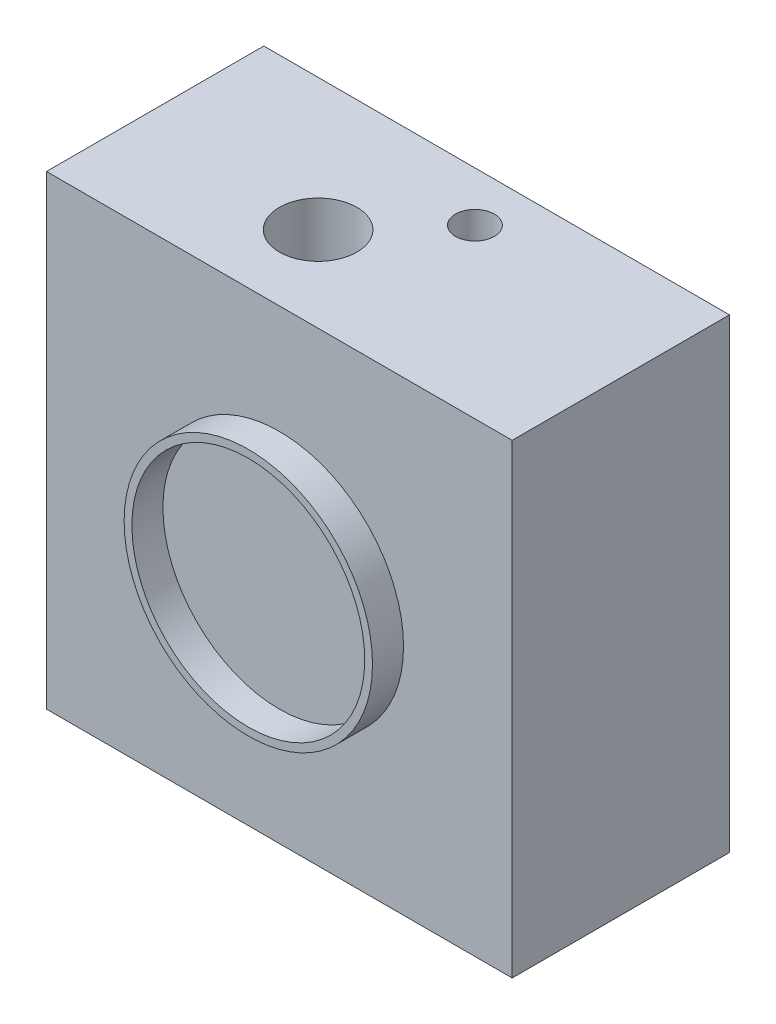
ISO-10303-21;
HEADER;
FILE_DESCRIPTION(('STEP AP214'),'2;1');
FILE_NAME('part.step','',(''),(''),'','','');
FILE_SCHEMA(('AUTOMOTIVE_DESIGN { 1 0 10303 214 1 1 1 1 }'));
ENDSEC;
DATA;
#1=APPLICATION_CONTEXT('core data for automotive mechanical design processes');
#2=APPLICATION_PROTOCOL_DEFINITION('international standard','automotive_design',2000,#1);
#3=PRODUCT_CONTEXT('',#1,'mechanical');
#4=PRODUCT('Part','Part','',(#3));
#5=PRODUCT_RELATED_PRODUCT_CATEGORY('part','',(#4));
#6=PRODUCT_DEFINITION_FORMATION('','',#4);
#7=PRODUCT_DEFINITION_CONTEXT('part definition',#1,'design');
#8=PRODUCT_DEFINITION('design','',#6,#7);
#9=PRODUCT_DEFINITION_SHAPE('','',#8);
#10=(LENGTH_UNIT() NAMED_UNIT(*) SI_UNIT(.MILLI.,.METRE.));
#11=(NAMED_UNIT(*) PLANE_ANGLE_UNIT() SI_UNIT($,.RADIAN.));
#12=(NAMED_UNIT(*) SI_UNIT($,.STERADIAN.) SOLID_ANGLE_UNIT());
#13=UNCERTAINTY_MEASURE_WITH_UNIT(LENGTH_MEASURE(1.E-05),#10,'distance_accuracy_value','');
#14=(GEOMETRIC_REPRESENTATION_CONTEXT(3) GLOBAL_UNCERTAINTY_ASSIGNED_CONTEXT((#13)) GLOBAL_UNIT_ASSIGNED_CONTEXT((#10,
#11,#12)) REPRESENTATION_CONTEXT('',''));
#15=CARTESIAN_POINT('',(0.,0.,0.));
#16=DIRECTION('',(0.,0.,1.));
#17=DIRECTION('',(1.,0.,0.));
#18=AXIS2_PLACEMENT_3D('',#15,#16,#17);
#19=CARTESIAN_POINT('',(15.,15.,14.));
#20=DIRECTION('',(-1.,0.,0.));
#21=DIRECTION('',(0.,-1.,0.));
#22=AXIS2_PLACEMENT_3D('',#19,#20,#21);
#23=PLANE('',#22);
#24=DIRECTION('',(0.,1.,0.));
#25=VECTOR('',#24,1.);
#26=CARTESIAN_POINT('',(15.,15.,0.));
#27=LINE('',#26,#25);
#28=CARTESIAN_POINT('',(15.,-15.,0.));
#29=VERTEX_POINT('',#28);
#30=CARTESIAN_POINT('',(15.,15.,0.));
#31=VERTEX_POINT('',#30);
#32=EDGE_CURVE('E124',#29,#31,#27,.T.);
#33=ORIENTED_EDGE('',*,*,#32,.T.);
#34=DIRECTION('',(0.,0.,-1.));
#35=VECTOR('',#34,1.);
#36=CARTESIAN_POINT('',(15.,15.,14.));
#37=LINE('',#36,#35);
#38=CARTESIAN_POINT('',(15.,15.,14.));
#39=VERTEX_POINT('',#38);
#40=EDGE_CURVE('E50',#39,#31,#37,.T.);
#41=ORIENTED_EDGE('',*,*,#40,.F.);
#42=DIRECTION('',(0.,1.,0.));
#43=VECTOR('',#42,1.);
#44=CARTESIAN_POINT('',(15.,15.,14.));
#45=LINE('',#44,#43);
#46=CARTESIAN_POINT('',(15.,-15.,14.));
#47=VERTEX_POINT('',#46);
#48=EDGE_CURVE('E127',#47,#39,#45,.T.);
#49=ORIENTED_EDGE('',*,*,#48,.F.);
#50=DIRECTION('',(0.,0.,-1.));
#51=VECTOR('',#50,1.);
#52=CARTESIAN_POINT('',(15.,-15.,14.));
#53=LINE('',#52,#51);
#54=EDGE_CURVE('E133',#47,#29,#53,.T.);
#55=ORIENTED_EDGE('',*,*,#54,.T.);
#56=EDGE_LOOP('',(#33,#41,#49,#55));
#57=FACE_BOUND('',#56,.T.);
#58=ADVANCED_FACE('F42',(#57),#23,.F.);
#59=CARTESIAN_POINT('',(-15.,15.,14.));
#60=DIRECTION('',(0.,-1.,0.));
#61=DIRECTION('',(0.,0.,-1.));
#62=AXIS2_PLACEMENT_3D('',#59,#60,#61);
#63=PLANE('',#62);
#64=CARTESIAN_POINT('',(1.8,15.,3.2));
#65=DIRECTION('',(0.,1.,0.));
#66=DIRECTION('',(0.,0.,1.));
#67=AXIS2_PLACEMENT_3D('',#64,#65,#66);
#68=CIRCLE('',#67,1.25);
#69=CARTESIAN_POINT('',(1.8,15.,4.45));
#70=VERTEX_POINT('',#69);
#71=EDGE_CURVE('E105',#70,#70,#68,.T.);
#72=ORIENTED_EDGE('',*,*,#71,.F.);
#73=EDGE_LOOP('',(#72));
#74=FACE_BOUND('',#73,.T.);
#75=CARTESIAN_POINT('',(-3.,15.,8.5));
#76=DIRECTION('',(0.,1.,0.));
#77=DIRECTION('',(0.,0.,1.));
#78=AXIS2_PLACEMENT_3D('',#75,#76,#77);
#79=CIRCLE('',#78,2.5);
#80=CARTESIAN_POINT('',(-3.,15.,11.));
#81=VERTEX_POINT('',#80);
#82=EDGE_CURVE('E104',#81,#81,#79,.T.);
#83=ORIENTED_EDGE('',*,*,#82,.F.);
#84=EDGE_LOOP('',(#83));
#85=FACE_BOUND('',#84,.T.);
#86=DIRECTION('',(-1.,0.,0.));
#87=VECTOR('',#86,1.);
#88=CARTESIAN_POINT('',(-15.,15.,0.));
#89=LINE('',#88,#87);
#90=CARTESIAN_POINT('',(-15.,15.,0.));
#91=VERTEX_POINT('',#90);
#92=EDGE_CURVE('E136',#31,#91,#89,.T.);
#93=ORIENTED_EDGE('',*,*,#92,.T.);
#94=DIRECTION('',(0.,0.,-1.));
#95=VECTOR('',#94,1.);
#96=CARTESIAN_POINT('',(-15.,15.,14.));
#97=LINE('',#96,#95);
#98=CARTESIAN_POINT('',(-15.,15.,14.));
#99=VERTEX_POINT('',#98);
#100=EDGE_CURVE('E143',#99,#91,#97,.T.);
#101=ORIENTED_EDGE('',*,*,#100,.F.);
#102=DIRECTION('',(-1.,0.,0.));
#103=VECTOR('',#102,1.);
#104=CARTESIAN_POINT('',(-15.,15.,14.));
#105=LINE('',#104,#103);
#106=EDGE_CURVE('E90',#39,#99,#105,.T.);
#107=ORIENTED_EDGE('',*,*,#106,.F.);
#108=ORIENTED_EDGE('',*,*,#40,.T.);
#109=EDGE_LOOP('',(#93,#101,#107,#108));
#110=FACE_BOUND('',#109,.T.);
#111=ADVANCED_FACE('F145',(#74,#85,#110),#63,.F.);
#112=CARTESIAN_POINT('',(-15.,15.,14.));
#113=DIRECTION('',(1.,0.,0.));
#114=DIRECTION('',(0.,1.,0.));
#115=AXIS2_PLACEMENT_3D('',#112,#113,#114);
#116=PLANE('',#115);
#117=DIRECTION('',(0.,-1.,0.));
#118=VECTOR('',#117,1.);
#119=CARTESIAN_POINT('',(-15.,15.,0.));
#120=LINE('',#119,#118);
#121=CARTESIAN_POINT('',(-15.,-15.,0.));
#122=VERTEX_POINT('',#121);
#123=EDGE_CURVE('E76',#91,#122,#120,.T.);
#124=ORIENTED_EDGE('',*,*,#123,.T.);
#125=DIRECTION('',(0.,0.,-1.));
#126=VECTOR('',#125,1.);
#127=CARTESIAN_POINT('',(-15.,-15.,14.));
#128=LINE('',#127,#126);
#129=CARTESIAN_POINT('',(-15.,-15.,14.));
#130=VERTEX_POINT('',#129);
#131=EDGE_CURVE('E141',#130,#122,#128,.T.);
#132=ORIENTED_EDGE('',*,*,#131,.F.);
#133=DIRECTION('',(0.,-1.,0.));
#134=VECTOR('',#133,1.);
#135=CARTESIAN_POINT('',(-15.,15.,14.));
#136=LINE('',#135,#134);
#137=EDGE_CURVE('E130',#99,#130,#136,.T.);
#138=ORIENTED_EDGE('',*,*,#137,.F.);
#139=ORIENTED_EDGE('',*,*,#100,.T.);
#140=EDGE_LOOP('',(#124,#132,#138,#139));
#141=FACE_BOUND('',#140,.T.);
#142=ADVANCED_FACE('F174',(#141),#116,.F.);
#143=CARTESIAN_POINT('',(-15.,-15.,14.));
#144=DIRECTION('',(0.,1.,0.));
#145=DIRECTION('',(0.,0.,1.));
#146=AXIS2_PLACEMENT_3D('',#143,#144,#145);
#147=PLANE('',#146);
#148=DIRECTION('',(1.,0.,0.));
#149=VECTOR('',#148,1.);
#150=CARTESIAN_POINT('',(-15.,-15.,0.));
#151=LINE('',#150,#149);
#152=EDGE_CURVE('E82',#122,#29,#151,.T.);
#153=ORIENTED_EDGE('',*,*,#152,.T.);
#154=ORIENTED_EDGE('',*,*,#54,.F.);
#155=DIRECTION('',(1.,0.,0.));
#156=VECTOR('',#155,1.);
#157=CARTESIAN_POINT('',(-15.,-15.,14.));
#158=LINE('',#157,#156);
#159=EDGE_CURVE('E58',#130,#47,#158,.T.);
#160=ORIENTED_EDGE('',*,*,#159,.F.);
#161=ORIENTED_EDGE('',*,*,#131,.T.);
#162=EDGE_LOOP('',(#153,#154,#160,#161));
#163=FACE_BOUND('',#162,.T.);
#164=ADVANCED_FACE('F163',(#163),#147,.F.);
#165=CARTESIAN_POINT('',(0.,0.,14.));
#166=DIRECTION('',(0.,0.,1.));
#167=DIRECTION('',(1.,0.,0.));
#168=AXIS2_PLACEMENT_3D('',#165,#166,#167);
#169=PLANE('',#168);
#170=CARTESIAN_POINT('',(0.,0.,14.));
#171=DIRECTION('',(0.,0.,1.));
#172=DIRECTION('',(1.,0.,0.));
#173=AXIS2_PLACEMENT_3D('',#170,#171,#172);
#174=CIRCLE('',#173,8.);
#175=CARTESIAN_POINT('',(8.,0.,14.));
#176=VERTEX_POINT('',#175);
#177=EDGE_CURVE('E120',#176,#176,#174,.T.);
#178=ORIENTED_EDGE('',*,*,#177,.F.);
#179=EDGE_LOOP('',(#178));
#180=FACE_BOUND('',#179,.T.);
#181=ORIENTED_EDGE('',*,*,#48,.T.);
#182=ORIENTED_EDGE('',*,*,#106,.T.);
#183=ORIENTED_EDGE('',*,*,#137,.T.);
#184=ORIENTED_EDGE('',*,*,#159,.T.);
#185=EDGE_LOOP('',(#181,#182,#183,#184));
#186=FACE_BOUND('',#185,.T.);
#187=ADVANCED_FACE('F153',(#180,#186),#169,.T.);
#188=CARTESIAN_POINT('',(0.,0.,0.));
#189=DIRECTION('',(0.,0.,1.));
#190=DIRECTION('',(1.,0.,0.));
#191=AXIS2_PLACEMENT_3D('',#188,#189,#190);
#192=PLANE('',#191);
#193=CARTESIAN_POINT('',(9.,8.91691507418454,0.));
#194=DIRECTION('',(0.,0.,-1.));
#195=DIRECTION('',(-1.,0.,0.));
#196=AXIS2_PLACEMENT_3D('',#193,#194,#195);
#197=CIRCLE('',#196,3.00000000000001);
#198=CARTESIAN_POINT('',(5.99999999999999,8.91691507418454,0.));
#199=VERTEX_POINT('',#198);
#200=EDGE_CURVE('E443',#199,#199,#197,.T.);
#201=ORIENTED_EDGE('',*,*,#200,.F.);
#202=EDGE_LOOP('',(#201));
#203=FACE_BOUND('',#202,.T.);
#204=CARTESIAN_POINT('',(-9.,9.,0.));
#205=DIRECTION('',(0.,0.,-1.));
#206=DIRECTION('',(-1.,0.,0.));
#207=AXIS2_PLACEMENT_3D('',#204,#205,#206);
#208=CIRCLE('',#207,3.00000000000001);
#209=CARTESIAN_POINT('',(-12.,9.,0.));
#210=VERTEX_POINT('',#209);
#211=EDGE_CURVE('E453',#210,#210,#208,.T.);
#212=ORIENTED_EDGE('',*,*,#211,.F.);
#213=EDGE_LOOP('',(#212));
#214=FACE_BOUND('',#213,.T.);
#215=CARTESIAN_POINT('',(-9.,-9.,0.));
#216=DIRECTION('',(0.,0.,-1.));
#217=DIRECTION('',(-1.,0.,0.));
#218=AXIS2_PLACEMENT_3D('',#215,#216,#217);
#219=CIRCLE('',#218,3.00000000000001);
#220=CARTESIAN_POINT('',(-12.,-9.,0.));
#221=VERTEX_POINT('',#220);
#222=EDGE_CURVE('E465',#221,#221,#219,.T.);
#223=ORIENTED_EDGE('',*,*,#222,.F.);
#224=EDGE_LOOP('',(#223));
#225=FACE_BOUND('',#224,.T.);
#226=CARTESIAN_POINT('',(9.,-9.,0.));
#227=DIRECTION('',(0.,0.,-1.));
#228=DIRECTION('',(-1.,0.,0.));
#229=AXIS2_PLACEMENT_3D('',#226,#227,#228);
#230=CIRCLE('',#229,3.00000000000001);
#231=CARTESIAN_POINT('',(5.99999999999998,-9.,0.));
#232=VERTEX_POINT('',#231);
#233=EDGE_CURVE('E477',#232,#232,#230,.T.);
#234=ORIENTED_EDGE('',*,*,#233,.F.);
#235=EDGE_LOOP('',(#234));
#236=FACE_BOUND('',#235,.T.);
#237=ORIENTED_EDGE('',*,*,#32,.F.);
#238=ORIENTED_EDGE('',*,*,#152,.F.);
#239=ORIENTED_EDGE('',*,*,#123,.F.);
#240=ORIENTED_EDGE('',*,*,#92,.F.);
#241=EDGE_LOOP('',(#237,#238,#239,#240));
#242=FACE_BOUND('',#241,.T.);
#243=ADVANCED_FACE('F150',(#203,#214,#225,#236,#242),#192,.F.);
#244=CARTESIAN_POINT('',(0.,0.,16.));
#245=DIRECTION('',(0.,0.,1.));
#246=DIRECTION('',(1.,0.,0.));
#247=AXIS2_PLACEMENT_3D('',#244,#245,#246);
#248=PLANE('',#247);
#249=CARTESIAN_POINT('',(0.,0.,16.));
#250=DIRECTION('',(0.,0.,1.));
#251=DIRECTION('',(1.,0.,0.));
#252=AXIS2_PLACEMENT_3D('',#249,#250,#251);
#253=CIRCLE('',#252,8.);
#254=CARTESIAN_POINT('',(8.,0.,16.));
#255=VERTEX_POINT('',#254);
#256=EDGE_CURVE('E121',#255,#255,#253,.T.);
#257=ORIENTED_EDGE('',*,*,#256,.T.);
#258=EDGE_LOOP('',(#257));
#259=FACE_BOUND('',#258,.T.);
#260=CARTESIAN_POINT('',(0.,0.,16.));
#261=DIRECTION('',(0.,0.,1.));
#262=DIRECTION('',(1.,0.,0.));
#263=AXIS2_PLACEMENT_3D('',#260,#261,#262);
#264=CIRCLE('',#263,7.5);
#265=CARTESIAN_POINT('',(7.5,0.,16.));
#266=VERTEX_POINT('',#265);
#267=EDGE_CURVE('E116',#266,#266,#264,.T.);
#268=ORIENTED_EDGE('',*,*,#267,.F.);
#269=EDGE_LOOP('',(#268));
#270=FACE_BOUND('',#269,.T.);
#271=ADVANCED_FACE('F152',(#259,#270),#248,.T.);
#272=CARTESIAN_POINT('',(0.,0.,16.));
#273=DIRECTION('',(0.,0.,-1.));
#274=DIRECTION('',(-1.,0.,0.));
#275=AXIS2_PLACEMENT_3D('',#272,#273,#274);
#276=CYLINDRICAL_SURFACE('',#275,8.);
#277=ORIENTED_EDGE('',*,*,#256,.F.);
#278=EDGE_LOOP('',(#277));
#279=FACE_BOUND('',#278,.T.);
#280=ORIENTED_EDGE('',*,*,#177,.T.);
#281=EDGE_LOOP('',(#280));
#282=FACE_BOUND('',#281,.T.);
#283=ADVANCED_FACE('F160',(#279,#282),#276,.T.);
#284=CARTESIAN_POINT('',(0.,0.,16.));
#285=DIRECTION('',(0.,0.,-1.));
#286=DIRECTION('',(-1.,0.,0.));
#287=AXIS2_PLACEMENT_3D('',#284,#285,#286);
#288=CYLINDRICAL_SURFACE('',#287,7.5);
#289=ORIENTED_EDGE('',*,*,#267,.T.);
#290=EDGE_LOOP('',(#289));
#291=FACE_BOUND('',#290,.T.);
#292=CARTESIAN_POINT('',(0.,0.,14.));
#293=DIRECTION('',(0.,0.,1.));
#294=DIRECTION('',(1.,0.,0.));
#295=AXIS2_PLACEMENT_3D('',#292,#293,#294);
#296=CIRCLE('',#295,7.5);
#297=CARTESIAN_POINT('',(7.5,0.,14.));
#298=VERTEX_POINT('',#297);
#299=EDGE_CURVE('E11',#298,#298,#296,.F.);
#300=ORIENTED_EDGE('',*,*,#299,.T.);
#301=EDGE_LOOP('',(#300));
#302=FACE_BOUND('',#301,.T.);
#303=ADVANCED_FACE('F208',(#291,#302),#288,.F.);
#304=ORIENTED_EDGE('',*,*,#299,.F.);
#305=EDGE_LOOP('',(#304));
#306=FACE_BOUND('',#305,.T.);
#307=ADVANCED_FACE('F166',(#306),#169,.T.);
#308=CARTESIAN_POINT('',(-3.,0.,8.5));
#309=DIRECTION('',(0.,1.,0.));
#310=DIRECTION('',(0.,0.,1.));
#311=AXIS2_PLACEMENT_3D('',#308,#309,#310);
#312=CYLINDRICAL_SURFACE('',#311,2.5);
#313=CARTESIAN_POINT('',(-3.,0.,8.5));
#314=DIRECTION('',(0.,1.,0.));
#315=DIRECTION('',(0.,0.,1.));
#316=AXIS2_PLACEMENT_3D('',#313,#314,#315);
#317=CIRCLE('',#316,2.5);
#318=CARTESIAN_POINT('',(-3.,0.,11.));
#319=VERTEX_POINT('',#318);
#320=EDGE_CURVE('E108',#319,#319,#317,.T.);
#321=ORIENTED_EDGE('',*,*,#320,.F.);
#322=EDGE_LOOP('',(#321));
#323=FACE_BOUND('',#322,.T.);
#324=ORIENTED_EDGE('',*,*,#82,.T.);
#325=EDGE_LOOP('',(#324));
#326=FACE_BOUND('',#325,.T.);
#327=ADVANCED_FACE('F227',(#323,#326),#312,.F.);
#328=CARTESIAN_POINT('',(-3.,0.,8.5));
#329=DIRECTION('',(0.,1.,0.));
#330=DIRECTION('',(0.,0.,1.));
#331=AXIS2_PLACEMENT_3D('',#328,#329,#330);
#332=PLANE('',#331);
#333=ORIENTED_EDGE('',*,*,#320,.T.);
#334=EDGE_LOOP('',(#333));
#335=FACE_BOUND('',#334,.T.);
#336=ADVANCED_FACE('F98',(#335),#332,.T.);
#337=CARTESIAN_POINT('',(1.8,7.5,3.2));
#338=DIRECTION('',(0.,1.,0.));
#339=DIRECTION('',(0.,0.,1.));
#340=AXIS2_PLACEMENT_3D('',#337,#338,#339);
#341=CONICAL_SURFACE('',#340,1.25,1.02974425867665);
#342=CARTESIAN_POINT('',(1.8,6.74892422621555,3.2));
#343=VERTEX_POINT('',#342);
#344=VERTEX_LOOP('',#343);
#345=FACE_BOUND('',#344,.T.);
#346=CARTESIAN_POINT('',(1.8,7.5,3.2));
#347=DIRECTION('',(0.,1.,0.));
#348=DIRECTION('',(0.,0.,1.));
#349=AXIS2_PLACEMENT_3D('',#346,#347,#348);
#350=CIRCLE('',#349,1.25);
#351=CARTESIAN_POINT('',(1.8,7.5,4.45));
#352=VERTEX_POINT('',#351);
#353=EDGE_CURVE('E102',#352,#352,#350,.T.);
#354=ORIENTED_EDGE('',*,*,#353,.T.);
#355=EDGE_LOOP('',(#354));
#356=FACE_BOUND('',#355,.T.);
#357=ADVANCED_FACE('F94',(#345,#356),#341,.F.);
#358=CARTESIAN_POINT('',(1.8,15.,3.2));
#359=DIRECTION('',(0.,1.,0.));
#360=DIRECTION('',(0.,0.,1.));
#361=AXIS2_PLACEMENT_3D('',#358,#359,#360);
#362=CYLINDRICAL_SURFACE('',#361,1.25);
#363=ORIENTED_EDGE('',*,*,#353,.F.);
#364=EDGE_LOOP('',(#363));
#365=FACE_BOUND('',#364,.T.);
#366=ORIENTED_EDGE('',*,*,#71,.T.);
#367=EDGE_LOOP('',(#366));
#368=FACE_BOUND('',#367,.T.);
#369=ADVANCED_FACE('F97',(#365,#368),#362,.F.);
#370=CARTESIAN_POINT('',(9.,-9.,9.));
#371=DIRECTION('',(0.,0.,1.));
#372=DIRECTION('',(1.,0.,0.));
#373=AXIS2_PLACEMENT_3D('',#370,#371,#372);
#374=PLANE('',#373);
#375=CARTESIAN_POINT('',(9.,-9.,9.));
#376=DIRECTION('',(0.,0.,-1.));
#377=DIRECTION('',(-1.,0.,0.));
#378=AXIS2_PLACEMENT_3D('',#375,#376,#377);
#379=CIRCLE('',#378,1.50000000000001);
#380=CARTESIAN_POINT('',(7.49999999999999,-9.,9.));
#381=VERTEX_POINT('',#380);
#382=EDGE_CURVE('E111',#381,#381,#379,.T.);
#383=ORIENTED_EDGE('',*,*,#382,.T.);
#384=EDGE_LOOP('',(#383));
#385=FACE_BOUND('',#384,.T.);
#386=ADVANCED_FACE('F265',(#385),#374,.F.);
#387=CARTESIAN_POINT('',(9.,-9.,0.));
#388=DIRECTION('',(0.,0.,-1.));
#389=DIRECTION('',(-1.,0.,0.));
#390=AXIS2_PLACEMENT_3D('',#387,#388,#389);
#391=CYLINDRICAL_SURFACE('',#390,1.50000000000001);
#392=ORIENTED_EDGE('',*,*,#382,.F.);
#393=EDGE_LOOP('',(#392));
#394=FACE_BOUND('',#393,.T.);
#395=CARTESIAN_POINT('',(9.,-9.,5.));
#396=DIRECTION('',(0.,0.,-1.));
#397=DIRECTION('',(-1.,0.,0.));
#398=AXIS2_PLACEMENT_3D('',#395,#396,#397);
#399=CIRCLE('',#398,1.50000000000001);
#400=CARTESIAN_POINT('',(7.49999999999999,-9.,5.));
#401=VERTEX_POINT('',#400);
#402=EDGE_CURVE('E483',#401,#401,#399,.T.);
#403=ORIENTED_EDGE('',*,*,#402,.T.);
#404=EDGE_LOOP('',(#403));
#405=FACE_BOUND('',#404,.T.);
#406=ADVANCED_FACE('F280',(#394,#405),#391,.F.);
#407=CARTESIAN_POINT('',(10.5,-9.,5.));
#408=DIRECTION('',(0.,0.,1.));
#409=DIRECTION('',(1.,0.,0.));
#410=AXIS2_PLACEMENT_3D('',#407,#408,#409);
#411=PLANE('',#410);
#412=ORIENTED_EDGE('',*,*,#402,.F.);
#413=EDGE_LOOP('',(#412));
#414=FACE_BOUND('',#413,.T.);
#415=CARTESIAN_POINT('',(9.,-9.,5.));
#416=DIRECTION('',(0.,0.,-1.));
#417=DIRECTION('',(-1.,0.,0.));
#418=AXIS2_PLACEMENT_3D('',#415,#416,#417);
#419=CIRCLE('',#418,3.00000000000001);
#420=CARTESIAN_POINT('',(5.99999999999998,-9.,5.));
#421=VERTEX_POINT('',#420);
#422=EDGE_CURVE('E480',#421,#421,#419,.T.);
#423=ORIENTED_EDGE('',*,*,#422,.T.);
#424=EDGE_LOOP('',(#423));
#425=FACE_BOUND('',#424,.T.);
#426=ADVANCED_FACE('F290',(#414,#425),#411,.F.);
#427=CARTESIAN_POINT('',(9.,-9.,0.));
#428=DIRECTION('',(0.,0.,-1.));
#429=DIRECTION('',(-1.,0.,0.));
#430=AXIS2_PLACEMENT_3D('',#427,#428,#429);
#431=CYLINDRICAL_SURFACE('',#430,3.00000000000001);
#432=ORIENTED_EDGE('',*,*,#422,.F.);
#433=EDGE_LOOP('',(#432));
#434=FACE_BOUND('',#433,.T.);
#435=ORIENTED_EDGE('',*,*,#233,.T.);
#436=EDGE_LOOP('',(#435));
#437=FACE_BOUND('',#436,.T.);
#438=ADVANCED_FACE('F300',(#434,#437),#431,.F.);
#439=CARTESIAN_POINT('',(-9.,-9.,9.));
#440=DIRECTION('',(0.,0.,1.));
#441=DIRECTION('',(1.,0.,0.));
#442=AXIS2_PLACEMENT_3D('',#439,#440,#441);
#443=PLANE('',#442);
#444=CARTESIAN_POINT('',(-9.,-9.,9.));
#445=DIRECTION('',(0.,0.,-1.));
#446=DIRECTION('',(-1.,0.,0.));
#447=AXIS2_PLACEMENT_3D('',#444,#445,#446);
#448=CIRCLE('',#447,1.50000000000001);
#449=CARTESIAN_POINT('',(-10.5,-9.,9.));
#450=VERTEX_POINT('',#449);
#451=EDGE_CURVE('E474',#450,#450,#448,.T.);
#452=ORIENTED_EDGE('',*,*,#451,.T.);
#453=EDGE_LOOP('',(#452));
#454=FACE_BOUND('',#453,.T.);
#455=ADVANCED_FACE('F311',(#454),#443,.F.);
#456=CARTESIAN_POINT('',(-9.,-9.,0.));
#457=DIRECTION('',(0.,0.,-1.));
#458=DIRECTION('',(-1.,0.,0.));
#459=AXIS2_PLACEMENT_3D('',#456,#457,#458);
#460=CYLINDRICAL_SURFACE('',#459,1.50000000000001);
#461=ORIENTED_EDGE('',*,*,#451,.F.);
#462=EDGE_LOOP('',(#461));
#463=FACE_BOUND('',#462,.T.);
#464=CARTESIAN_POINT('',(-9.,-9.,5.));
#465=DIRECTION('',(0.,0.,-1.));
#466=DIRECTION('',(-1.,0.,0.));
#467=AXIS2_PLACEMENT_3D('',#464,#465,#466);
#468=CIRCLE('',#467,1.50000000000001);
#469=CARTESIAN_POINT('',(-10.5,-9.,5.));
#470=VERTEX_POINT('',#469);
#471=EDGE_CURVE('E471',#470,#470,#468,.T.);
#472=ORIENTED_EDGE('',*,*,#471,.T.);
#473=EDGE_LOOP('',(#472));
#474=FACE_BOUND('',#473,.T.);
#475=ADVANCED_FACE('F322',(#463,#474),#460,.F.);
#476=CARTESIAN_POINT('',(-7.49999999999999,-9.,5.));
#477=DIRECTION('',(0.,0.,1.));
#478=DIRECTION('',(1.,0.,0.));
#479=AXIS2_PLACEMENT_3D('',#476,#477,#478);
#480=PLANE('',#479);
#481=ORIENTED_EDGE('',*,*,#471,.F.);
#482=EDGE_LOOP('',(#481));
#483=FACE_BOUND('',#482,.T.);
#484=CARTESIAN_POINT('',(-9.,-9.,5.));
#485=DIRECTION('',(0.,0.,-1.));
#486=DIRECTION('',(-1.,0.,0.));
#487=AXIS2_PLACEMENT_3D('',#484,#485,#486);
#488=CIRCLE('',#487,3.00000000000001);
#489=CARTESIAN_POINT('',(-12.,-9.,5.));
#490=VERTEX_POINT('',#489);
#491=EDGE_CURVE('E468',#490,#490,#488,.T.);
#492=ORIENTED_EDGE('',*,*,#491,.T.);
#493=EDGE_LOOP('',(#492));
#494=FACE_BOUND('',#493,.T.);
#495=ADVANCED_FACE('F332',(#483,#494),#480,.F.);
#496=CARTESIAN_POINT('',(-9.,-9.,0.));
#497=DIRECTION('',(0.,0.,-1.));
#498=DIRECTION('',(-1.,0.,0.));
#499=AXIS2_PLACEMENT_3D('',#496,#497,#498);
#500=CYLINDRICAL_SURFACE('',#499,3.00000000000001);
#501=ORIENTED_EDGE('',*,*,#491,.F.);
#502=EDGE_LOOP('',(#501));
#503=FACE_BOUND('',#502,.T.);
#504=ORIENTED_EDGE('',*,*,#222,.T.);
#505=EDGE_LOOP('',(#504));
#506=FACE_BOUND('',#505,.T.);
#507=ADVANCED_FACE('F342',(#503,#506),#500,.F.);
#508=CARTESIAN_POINT('',(-9.,9.,9.));
#509=DIRECTION('',(0.,0.,1.));
#510=DIRECTION('',(1.,0.,0.));
#511=AXIS2_PLACEMENT_3D('',#508,#509,#510);
#512=PLANE('',#511);
#513=CARTESIAN_POINT('',(-9.,9.,9.));
#514=DIRECTION('',(0.,0.,-1.));
#515=DIRECTION('',(-1.,0.,0.));
#516=AXIS2_PLACEMENT_3D('',#513,#514,#515);
#517=CIRCLE('',#516,1.50000000000001);
#518=CARTESIAN_POINT('',(-10.5,9.,9.));
#519=VERTEX_POINT('',#518);
#520=EDGE_CURVE('E462',#519,#519,#517,.T.);
#521=ORIENTED_EDGE('',*,*,#520,.T.);
#522=EDGE_LOOP('',(#521));
#523=FACE_BOUND('',#522,.T.);
#524=ADVANCED_FACE('F352',(#523),#512,.F.);
#525=CARTESIAN_POINT('',(-9.,9.,0.));
#526=DIRECTION('',(0.,0.,-1.));
#527=DIRECTION('',(-1.,0.,0.));
#528=AXIS2_PLACEMENT_3D('',#525,#526,#527);
#529=CYLINDRICAL_SURFACE('',#528,1.50000000000001);
#530=ORIENTED_EDGE('',*,*,#520,.F.);
#531=EDGE_LOOP('',(#530));
#532=FACE_BOUND('',#531,.T.);
#533=CARTESIAN_POINT('',(-9.,9.,5.));
#534=DIRECTION('',(0.,0.,-1.));
#535=DIRECTION('',(-1.,0.,0.));
#536=AXIS2_PLACEMENT_3D('',#533,#534,#535);
#537=CIRCLE('',#536,1.50000000000001);
#538=CARTESIAN_POINT('',(-10.5,9.,5.));
#539=VERTEX_POINT('',#538);
#540=EDGE_CURVE('E459',#539,#539,#537,.T.);
#541=ORIENTED_EDGE('',*,*,#540,.T.);
#542=EDGE_LOOP('',(#541));
#543=FACE_BOUND('',#542,.T.);
#544=ADVANCED_FACE('F363',(#532,#543),#529,.F.);
#545=CARTESIAN_POINT('',(-7.49999999999999,9.,5.));
#546=DIRECTION('',(0.,0.,1.));
#547=DIRECTION('',(1.,0.,0.));
#548=AXIS2_PLACEMENT_3D('',#545,#546,#547);
#549=PLANE('',#548);
#550=ORIENTED_EDGE('',*,*,#540,.F.);
#551=EDGE_LOOP('',(#550));
#552=FACE_BOUND('',#551,.T.);
#553=CARTESIAN_POINT('',(-9.,9.,5.));
#554=DIRECTION('',(0.,0.,-1.));
#555=DIRECTION('',(-1.,0.,0.));
#556=AXIS2_PLACEMENT_3D('',#553,#554,#555);
#557=CIRCLE('',#556,3.00000000000001);
#558=CARTESIAN_POINT('',(-12.,9.,5.));
#559=VERTEX_POINT('',#558);
#560=EDGE_CURVE('E456',#559,#559,#557,.T.);
#561=ORIENTED_EDGE('',*,*,#560,.T.);
#562=EDGE_LOOP('',(#561));
#563=FACE_BOUND('',#562,.T.);
#564=ADVANCED_FACE('F373',(#552,#563),#549,.F.);
#565=CARTESIAN_POINT('',(-9.,9.,0.));
#566=DIRECTION('',(0.,0.,-1.));
#567=DIRECTION('',(-1.,0.,0.));
#568=AXIS2_PLACEMENT_3D('',#565,#566,#567);
#569=CYLINDRICAL_SURFACE('',#568,3.00000000000001);
#570=ORIENTED_EDGE('',*,*,#560,.F.);
#571=EDGE_LOOP('',(#570));
#572=FACE_BOUND('',#571,.T.);
#573=ORIENTED_EDGE('',*,*,#211,.T.);
#574=EDGE_LOOP('',(#573));
#575=FACE_BOUND('',#574,.T.);
#576=ADVANCED_FACE('F383',(#572,#575),#569,.F.);
#577=CARTESIAN_POINT('',(9.,8.91691507418454,9.));
#578=DIRECTION('',(0.,0.,1.));
#579=DIRECTION('',(1.,0.,0.));
#580=AXIS2_PLACEMENT_3D('',#577,#578,#579);
#581=PLANE('',#580);
#582=CARTESIAN_POINT('',(9.,8.91691507418454,9.));
#583=DIRECTION('',(0.,0.,-1.));
#584=DIRECTION('',(-1.,0.,0.));
#585=AXIS2_PLACEMENT_3D('',#582,#583,#584);
#586=CIRCLE('',#585,1.50000000000001);
#587=CARTESIAN_POINT('',(7.49999999999999,8.91691507418454,9.));
#588=VERTEX_POINT('',#587);
#589=EDGE_CURVE('E450',#588,#588,#586,.T.);
#590=ORIENTED_EDGE('',*,*,#589,.T.);
#591=EDGE_LOOP('',(#590));
#592=FACE_BOUND('',#591,.T.);
#593=ADVANCED_FACE('F393',(#592),#581,.F.);
#594=CARTESIAN_POINT('',(9.,8.91691507418454,0.));
#595=DIRECTION('',(0.,0.,-1.));
#596=DIRECTION('',(-1.,0.,0.));
#597=AXIS2_PLACEMENT_3D('',#594,#595,#596);
#598=CYLINDRICAL_SURFACE('',#597,1.50000000000001);
#599=ORIENTED_EDGE('',*,*,#589,.F.);
#600=EDGE_LOOP('',(#599));
#601=FACE_BOUND('',#600,.T.);
#602=CARTESIAN_POINT('',(9.,8.91691507418454,5.));
#603=DIRECTION('',(0.,0.,-1.));
#604=DIRECTION('',(-1.,0.,0.));
#605=AXIS2_PLACEMENT_3D('',#602,#603,#604);
#606=CIRCLE('',#605,1.50000000000001);
#607=CARTESIAN_POINT('',(7.49999999999999,8.91691507418454,5.));
#608=VERTEX_POINT('',#607);
#609=EDGE_CURVE('E445',#608,#608,#606,.T.);
#610=ORIENTED_EDGE('',*,*,#609,.T.);
#611=EDGE_LOOP('',(#610));
#612=FACE_BOUND('',#611,.T.);
#613=ADVANCED_FACE('F403',(#601,#612),#598,.F.);
#614=CARTESIAN_POINT('',(10.5,8.91691507418454,5.));
#615=DIRECTION('',(0.,0.,1.));
#616=DIRECTION('',(1.,0.,0.));
#617=AXIS2_PLACEMENT_3D('',#614,#615,#616);
#618=PLANE('',#617);
#619=ORIENTED_EDGE('',*,*,#609,.F.);
#620=EDGE_LOOP('',(#619));
#621=FACE_BOUND('',#620,.T.);
#622=CARTESIAN_POINT('',(9.,8.91691507418454,5.));
#623=DIRECTION('',(0.,0.,-1.));
#624=DIRECTION('',(-1.,0.,0.));
#625=AXIS2_PLACEMENT_3D('',#622,#623,#624);
#626=CIRCLE('',#625,3.00000000000001);
#627=CARTESIAN_POINT('',(5.99999999999999,8.91691507418454,5.));
#628=VERTEX_POINT('',#627);
#629=EDGE_CURVE('E441',#628,#628,#626,.T.);
#630=ORIENTED_EDGE('',*,*,#629,.T.);
#631=EDGE_LOOP('',(#630));
#632=FACE_BOUND('',#631,.T.);
#633=ADVANCED_FACE('F413',(#621,#632),#618,.F.);
#634=CARTESIAN_POINT('',(9.,8.91691507418454,0.));
#635=DIRECTION('',(0.,0.,-1.));
#636=DIRECTION('',(-1.,0.,0.));
#637=AXIS2_PLACEMENT_3D('',#634,#635,#636);
#638=CYLINDRICAL_SURFACE('',#637,3.00000000000001);
#639=ORIENTED_EDGE('',*,*,#629,.F.);
#640=EDGE_LOOP('',(#639));
#641=FACE_BOUND('',#640,.T.);
#642=ORIENTED_EDGE('',*,*,#200,.T.);
#643=EDGE_LOOP('',(#642));
#644=FACE_BOUND('',#643,.T.);
#645=ADVANCED_FACE('F423',(#641,#644),#638,.F.);
#646=CLOSED_SHELL('',(#58,#111,#142,#164,#187,#243,#271,#283,#303,#307,#327,#336,#357,#369,#386,
#406,#426,#438,#455,#475,#495,#507,#524,#544,#564,#576,#593,#613,#633,#645));
#647=MANIFOLD_SOLID_BREP('B2',#646);
#648=ADVANCED_BREP_SHAPE_REPRESENTATION('',(#18,#647),#14);
#649=SHAPE_DEFINITION_REPRESENTATION(#9,#648);
ENDSEC;
END-ISO-10303-21;
